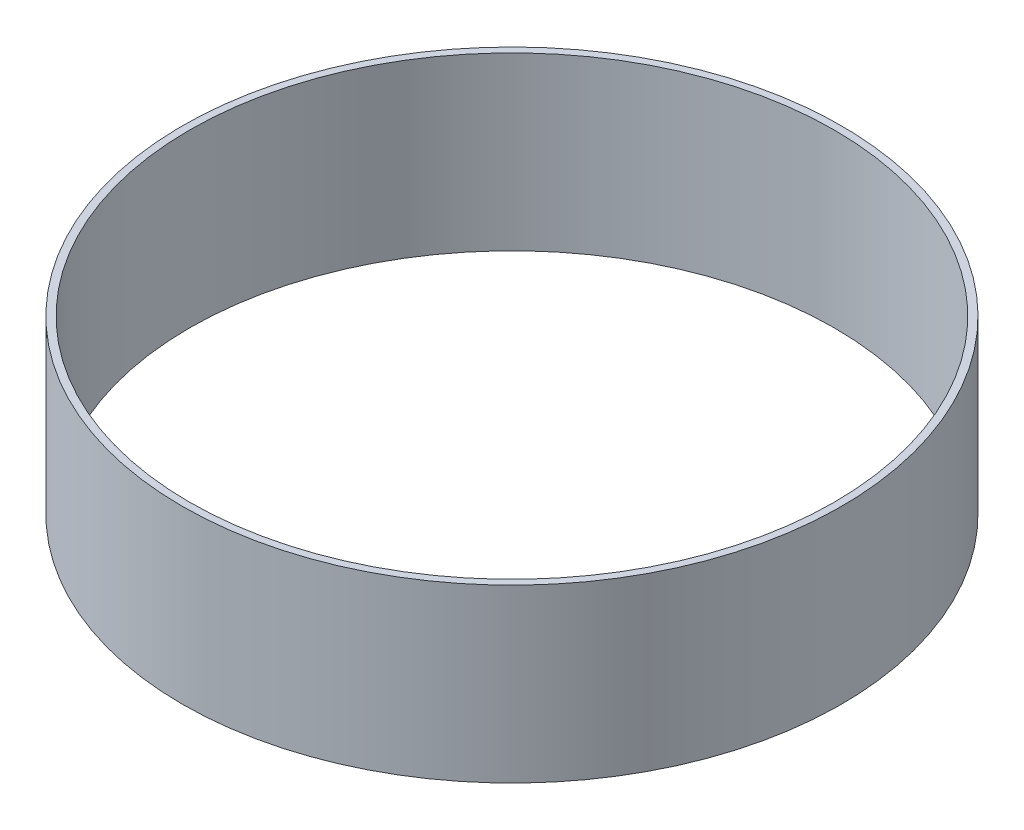
ISO-10303-21;
HEADER;
FILE_DESCRIPTION(('STEP AP214'),'2;1');
FILE_NAME('part.step','',(''),(''),'','','');
FILE_SCHEMA(('AUTOMOTIVE_DESIGN { 1 0 10303 214 1 1 1 1 }'));
ENDSEC;
DATA;
#1=APPLICATION_CONTEXT('core data for automotive mechanical design processes');
#2=APPLICATION_PROTOCOL_DEFINITION('international standard','automotive_design',2000,#1);
#3=PRODUCT_CONTEXT('',#1,'mechanical');
#4=PRODUCT('Part','Part','',(#3));
#5=PRODUCT_RELATED_PRODUCT_CATEGORY('part','',(#4));
#6=PRODUCT_DEFINITION_FORMATION('','',#4);
#7=PRODUCT_DEFINITION_CONTEXT('part definition',#1,'design');
#8=PRODUCT_DEFINITION('design','',#6,#7);
#9=PRODUCT_DEFINITION_SHAPE('','',#8);
#10=(LENGTH_UNIT() NAMED_UNIT(*) SI_UNIT(.MILLI.,.METRE.));
#11=(NAMED_UNIT(*) PLANE_ANGLE_UNIT() SI_UNIT($,.RADIAN.));
#12=(NAMED_UNIT(*) SI_UNIT($,.STERADIAN.) SOLID_ANGLE_UNIT());
#13=UNCERTAINTY_MEASURE_WITH_UNIT(LENGTH_MEASURE(1.E-05),#10,'distance_accuracy_value','');
#14=(GEOMETRIC_REPRESENTATION_CONTEXT(3) GLOBAL_UNCERTAINTY_ASSIGNED_CONTEXT((#13)) GLOBAL_UNIT_ASSIGNED_CONTEXT((#10,
#11,#12)) REPRESENTATION_CONTEXT('',''));
#15=CARTESIAN_POINT('',(0.,0.,0.));
#16=DIRECTION('',(0.,0.,1.));
#17=DIRECTION('',(1.,0.,0.));
#18=AXIS2_PLACEMENT_3D('',#15,#16,#17);
#19=CARTESIAN_POINT('',(-51.4375515041831,229.372258045113,-94.6729830182891));
#20=DIRECTION('',(0.,-1.,0.));
#21=DIRECTION('',(0.,0.,-1.));
#22=AXIS2_PLACEMENT_3D('',#19,#20,#21);
#23=CYLINDRICAL_SURFACE('',#22,68.4999999999998);
#24=CARTESIAN_POINT('',(-51.4375515041831,0.,-94.6729830182891));
#25=DIRECTION('',(0.,1.,0.));
#26=DIRECTION('',(0.,0.,1.));
#27=AXIS2_PLACEMENT_3D('',#24,#25,#26);
#28=CIRCLE('',#27,68.4999999999998);
#29=CARTESIAN_POINT('',(-51.4375515041831,0.,-26.1729830182893));
#30=VERTEX_POINT('',#29);
#31=EDGE_CURVE('E44',#30,#30,#28,.T.);
#32=ORIENTED_EDGE('',*,*,#31,.T.);
#33=EDGE_LOOP('',(#32));
#34=FACE_BOUND('',#33,.T.);
#35=CARTESIAN_POINT('',(-51.4375515041831,35.6249999999999,-94.6729830182891));
#36=DIRECTION('',(0.,1.,0.));
#37=DIRECTION('',(0.,0.,1.));
#38=AXIS2_PLACEMENT_3D('',#35,#36,#37);
#39=CIRCLE('',#38,68.4999999999998);
#40=CARTESIAN_POINT('',(-51.4375515041831,35.6249999999999,-26.1729830182893));
#41=VERTEX_POINT('',#40);
#42=EDGE_CURVE('E10',#41,#41,#39,.T.);
#43=ORIENTED_EDGE('',*,*,#42,.F.);
#44=EDGE_LOOP('',(#43));
#45=FACE_BOUND('',#44,.T.);
#46=ADVANCED_FACE('F37',(#34,#45),#23,.T.);
#47=CARTESIAN_POINT('',(-51.4375515041831,0.,-94.6729830182891));
#48=DIRECTION('',(0.,1.,0.));
#49=DIRECTION('',(0.,0.,1.));
#50=AXIS2_PLACEMENT_3D('',#47,#48,#49);
#51=PLANE('',#50);
#52=ORIENTED_EDGE('',*,*,#31,.F.);
#53=EDGE_LOOP('',(#52));
#54=FACE_BOUND('',#53,.T.);
#55=CARTESIAN_POINT('',(-51.4375515041831,0.,-94.6729830182891));
#56=DIRECTION('',(0.,1.,0.));
#57=DIRECTION('',(0.,0.,1.));
#58=AXIS2_PLACEMENT_3D('',#55,#56,#57);
#59=CIRCLE('',#58,66.9999999999998);
#60=CARTESIAN_POINT('',(-51.4375515041831,0.,-27.6729830182893));
#61=VERTEX_POINT('',#60);
#62=EDGE_CURVE('E49',#61,#61,#59,.T.);
#63=ORIENTED_EDGE('',*,*,#62,.T.);
#64=EDGE_LOOP('',(#63));
#65=FACE_BOUND('',#64,.T.);
#66=ADVANCED_FACE('F65',(#54,#65),#51,.F.);
#67=CARTESIAN_POINT('',(-51.4375515041831,229.372258045113,-94.6729830182891));
#68=DIRECTION('',(0.,-1.,0.));
#69=DIRECTION('',(0.,0.,-1.));
#70=AXIS2_PLACEMENT_3D('',#67,#68,#69);
#71=CYLINDRICAL_SURFACE('',#70,66.9999999999998);
#72=ORIENTED_EDGE('',*,*,#62,.F.);
#73=EDGE_LOOP('',(#72));
#74=FACE_BOUND('',#73,.T.);
#75=CARTESIAN_POINT('',(-51.4375515041831,35.6249999999999,-94.6729830182891));
#76=DIRECTION('',(0.,1.,0.));
#77=DIRECTION('',(0.,0.,1.));
#78=AXIS2_PLACEMENT_3D('',#75,#76,#77);
#79=CIRCLE('',#78,66.9999999999998);
#80=CARTESIAN_POINT('',(-51.4375515041831,35.6249999999999,-27.6729830182893));
#81=VERTEX_POINT('',#80);
#82=EDGE_CURVE('E40',#81,#81,#79,.T.);
#83=ORIENTED_EDGE('',*,*,#82,.T.);
#84=EDGE_LOOP('',(#83));
#85=FACE_BOUND('',#84,.T.);
#86=ADVANCED_FACE('F57',(#74,#85),#71,.F.);
#87=CARTESIAN_POINT('',(-51.4375515041836,35.6249999999999,-94.6729830182891));
#88=DIRECTION('',(0.,1.,0.));
#89=DIRECTION('',(-0.118023640640617,0.,-0.993010785565763));
#90=AXIS2_PLACEMENT_3D('',#87,#88,#89);
#91=PLANE('',#90);
#92=ORIENTED_EDGE('',*,*,#82,.F.);
#93=EDGE_LOOP('',(#92));
#94=FACE_BOUND('',#93,.T.);
#95=ORIENTED_EDGE('',*,*,#42,.T.);
#96=EDGE_LOOP('',(#95));
#97=FACE_BOUND('',#96,.T.);
#98=ADVANCED_FACE('F59',(#94,#97),#91,.T.);
#99=CLOSED_SHELL('',(#46,#66,#86,#98));
#100=MANIFOLD_SOLID_BREP('B2',#99);
#101=ADVANCED_BREP_SHAPE_REPRESENTATION('',(#18,#100),#14);
#102=SHAPE_DEFINITION_REPRESENTATION(#9,#101);
ENDSEC;
END-ISO-10303-21;
